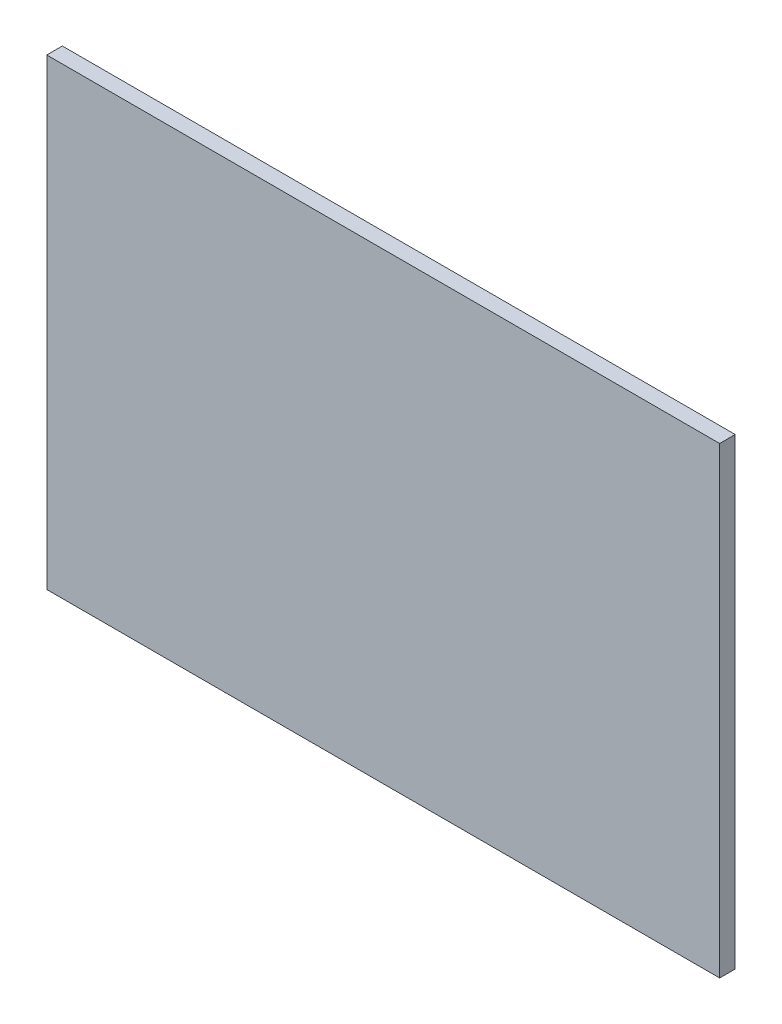
ISO-10303-21;
HEADER;
FILE_DESCRIPTION(('STEP AP214'),'2;1');
FILE_NAME('part.step','',(''),(''),'','','');
FILE_SCHEMA(('AUTOMOTIVE_DESIGN { 1 0 10303 214 1 1 1 1 }'));
ENDSEC;
DATA;
#1=APPLICATION_CONTEXT('core data for automotive mechanical design processes');
#2=APPLICATION_PROTOCOL_DEFINITION('international standard','automotive_design',2000,#1);
#3=PRODUCT_CONTEXT('',#1,'mechanical');
#4=PRODUCT('Part','Part','',(#3));
#5=PRODUCT_RELATED_PRODUCT_CATEGORY('part','',(#4));
#6=PRODUCT_DEFINITION_FORMATION('','',#4);
#7=PRODUCT_DEFINITION_CONTEXT('part definition',#1,'design');
#8=PRODUCT_DEFINITION('design','',#6,#7);
#9=PRODUCT_DEFINITION_SHAPE('','',#8);
#10=(LENGTH_UNIT() NAMED_UNIT(*) SI_UNIT(.MILLI.,.METRE.));
#11=(NAMED_UNIT(*) PLANE_ANGLE_UNIT() SI_UNIT($,.RADIAN.));
#12=(NAMED_UNIT(*) SI_UNIT($,.STERADIAN.) SOLID_ANGLE_UNIT());
#13=UNCERTAINTY_MEASURE_WITH_UNIT(LENGTH_MEASURE(1.E-05),#10,'distance_accuracy_value','');
#14=(GEOMETRIC_REPRESENTATION_CONTEXT(3) GLOBAL_UNCERTAINTY_ASSIGNED_CONTEXT((#13)) GLOBAL_UNIT_ASSIGNED_CONTEXT((#10,
#11,#12)) REPRESENTATION_CONTEXT('',''));
#15=CARTESIAN_POINT('',(0.,0.,0.));
#16=DIRECTION('',(0.,0.,1.));
#17=DIRECTION('',(1.,0.,0.));
#18=AXIS2_PLACEMENT_3D('',#15,#16,#17);
#19=CARTESIAN_POINT('',(2959.92889135267,1214.54135701156,19.05));
#20=DIRECTION('',(0.,1.,0.));
#21=DIRECTION('',(0.,0.,1.));
#22=AXIS2_PLACEMENT_3D('',#19,#20,#21);
#23=PLANE('',#22);
#24=DIRECTION('',(1.,0.,0.));
#25=VECTOR('',#24,1.);
#26=CARTESIAN_POINT('',(2959.92889135267,1214.54135701156,0.));
#27=LINE('',#26,#25);
#28=CARTESIAN_POINT('',(2959.92889135267,1214.54135701156,0.));
#29=VERTEX_POINT('',#28);
#30=CARTESIAN_POINT('',(3783.30037135267,1214.54135701156,0.));
#31=VERTEX_POINT('',#30);
#32=EDGE_CURVE('E96',#29,#31,#27,.T.);
#33=ORIENTED_EDGE('',*,*,#32,.T.);
#34=DIRECTION('',(0.,0.,-1.));
#35=VECTOR('',#34,1.);
#36=CARTESIAN_POINT('',(3783.30037135267,1214.54135701156,19.05));
#37=LINE('',#36,#35);
#38=CARTESIAN_POINT('',(3783.30037135267,1214.54135701156,19.05));
#39=VERTEX_POINT('',#38);
#40=EDGE_CURVE('E11',#39,#31,#37,.T.);
#41=ORIENTED_EDGE('',*,*,#40,.F.);
#42=DIRECTION('',(1.,0.,0.));
#43=VECTOR('',#42,1.);
#44=CARTESIAN_POINT('',(2959.92889135267,1214.54135701156,19.05));
#45=LINE('',#44,#43);
#46=CARTESIAN_POINT('',(2959.92889135267,1214.54135701156,19.05));
#47=VERTEX_POINT('',#46);
#48=EDGE_CURVE('E84',#47,#39,#45,.T.);
#49=ORIENTED_EDGE('',*,*,#48,.F.);
#50=DIRECTION('',(0.,0.,-1.));
#51=VECTOR('',#50,1.);
#52=CARTESIAN_POINT('',(2959.92889135267,1214.54135701156,19.05));
#53=LINE('',#52,#51);
#54=EDGE_CURVE('E92',#47,#29,#53,.T.);
#55=ORIENTED_EDGE('',*,*,#54,.T.);
#56=EDGE_LOOP('',(#33,#41,#49,#55));
#57=FACE_BOUND('',#56,.T.);
#58=ADVANCED_FACE('F33',(#57),#23,.F.);
#59=CARTESIAN_POINT('',(3783.30037135267,1214.54135701156,19.05));
#60=DIRECTION('',(-1.,0.,0.));
#61=DIRECTION('',(0.,0.,1.));
#62=AXIS2_PLACEMENT_3D('',#59,#60,#61);
#63=PLANE('',#62);
#64=DIRECTION('',(0.,1.,0.));
#65=VECTOR('',#64,1.);
#66=CARTESIAN_POINT('',(3783.30037135267,1214.54135701156,0.));
#67=LINE('',#66,#65);
#68=CARTESIAN_POINT('',(3783.30037135267,1780.96135701156,0.));
#69=VERTEX_POINT('',#68);
#70=EDGE_CURVE('E88',#31,#69,#67,.T.);
#71=ORIENTED_EDGE('',*,*,#70,.T.);
#72=DIRECTION('',(0.,0.,-1.));
#73=VECTOR('',#72,1.);
#74=CARTESIAN_POINT('',(3783.30037135267,1780.96135701156,19.05));
#75=LINE('',#74,#73);
#76=CARTESIAN_POINT('',(3783.30037135267,1780.96135701156,19.05));
#77=VERTEX_POINT('',#76);
#78=EDGE_CURVE('E41',#77,#69,#75,.T.);
#79=ORIENTED_EDGE('',*,*,#78,.F.);
#80=DIRECTION('',(0.,1.,0.));
#81=VECTOR('',#80,1.);
#82=CARTESIAN_POINT('',(3783.30037135267,1214.54135701156,19.05));
#83=LINE('',#82,#81);
#84=EDGE_CURVE('E79',#39,#77,#83,.T.);
#85=ORIENTED_EDGE('',*,*,#84,.F.);
#86=ORIENTED_EDGE('',*,*,#40,.T.);
#87=EDGE_LOOP('',(#71,#79,#85,#86));
#88=FACE_BOUND('',#87,.T.);
#89=ADVANCED_FACE('F87',(#88),#63,.F.);
#90=CARTESIAN_POINT('',(3783.30037135267,1780.96135701156,19.05));
#91=DIRECTION('',(0.,-1.,0.));
#92=DIRECTION('',(0.,0.,-1.));
#93=AXIS2_PLACEMENT_3D('',#90,#91,#92);
#94=PLANE('',#93);
#95=DIRECTION('',(-1.,0.,0.));
#96=VECTOR('',#95,1.);
#97=CARTESIAN_POINT('',(3783.30037135267,1780.96135701156,0.));
#98=LINE('',#97,#96);
#99=CARTESIAN_POINT('',(2959.92889135267,1780.96135701156,0.));
#100=VERTEX_POINT('',#99);
#101=EDGE_CURVE('E66',#69,#100,#98,.T.);
#102=ORIENTED_EDGE('',*,*,#101,.T.);
#103=DIRECTION('',(0.,0.,-1.));
#104=VECTOR('',#103,1.);
#105=CARTESIAN_POINT('',(2959.92889135267,1780.96135701156,19.05));
#106=LINE('',#105,#104);
#107=CARTESIAN_POINT('',(2959.92889135267,1780.96135701156,19.05));
#108=VERTEX_POINT('',#107);
#109=EDGE_CURVE('E89',#108,#100,#106,.T.);
#110=ORIENTED_EDGE('',*,*,#109,.F.);
#111=DIRECTION('',(-1.,0.,0.));
#112=VECTOR('',#111,1.);
#113=CARTESIAN_POINT('',(3783.30037135267,1780.96135701156,19.05));
#114=LINE('',#113,#112);
#115=EDGE_CURVE('E82',#77,#108,#114,.T.);
#116=ORIENTED_EDGE('',*,*,#115,.F.);
#117=ORIENTED_EDGE('',*,*,#78,.T.);
#118=EDGE_LOOP('',(#102,#110,#116,#117));
#119=FACE_BOUND('',#118,.T.);
#120=ADVANCED_FACE('F90',(#119),#94,.F.);
#121=CARTESIAN_POINT('',(2959.92889135267,1780.96135701156,19.05));
#122=DIRECTION('',(1.,0.,0.));
#123=DIRECTION('',(0.,0.,-1.));
#124=AXIS2_PLACEMENT_3D('',#121,#122,#123);
#125=PLANE('',#124);
#126=DIRECTION('',(0.,-1.,0.));
#127=VECTOR('',#126,1.);
#128=CARTESIAN_POINT('',(2959.92889135267,1780.96135701156,0.));
#129=LINE('',#128,#127);
#130=EDGE_CURVE('E72',#100,#29,#129,.T.);
#131=ORIENTED_EDGE('',*,*,#130,.T.);
#132=ORIENTED_EDGE('',*,*,#54,.F.);
#133=DIRECTION('',(0.,-1.,0.));
#134=VECTOR('',#133,1.);
#135=CARTESIAN_POINT('',(2959.92889135267,1780.96135701156,19.05));
#136=LINE('',#135,#134);
#137=EDGE_CURVE('E49',#108,#47,#136,.T.);
#138=ORIENTED_EDGE('',*,*,#137,.F.);
#139=ORIENTED_EDGE('',*,*,#109,.T.);
#140=EDGE_LOOP('',(#131,#132,#138,#139));
#141=FACE_BOUND('',#140,.T.);
#142=ADVANCED_FACE('F103',(#141),#125,.F.);
#143=CARTESIAN_POINT('',(0.,0.,19.05));
#144=DIRECTION('',(0.,0.,1.));
#145=DIRECTION('',(1.,0.,0.));
#146=AXIS2_PLACEMENT_3D('',#143,#144,#145);
#147=PLANE('',#146);
#148=ORIENTED_EDGE('',*,*,#48,.T.);
#149=ORIENTED_EDGE('',*,*,#84,.T.);
#150=ORIENTED_EDGE('',*,*,#115,.T.);
#151=ORIENTED_EDGE('',*,*,#137,.T.);
#152=EDGE_LOOP('',(#148,#149,#150,#151));
#153=FACE_BOUND('',#152,.T.);
#154=ADVANCED_FACE('F80',(#153),#147,.T.);
#155=CARTESIAN_POINT('',(0.,0.,0.));
#156=DIRECTION('',(0.,0.,1.));
#157=DIRECTION('',(1.,0.,0.));
#158=AXIS2_PLACEMENT_3D('',#155,#156,#157);
#159=PLANE('',#158);
#160=ORIENTED_EDGE('',*,*,#32,.F.);
#161=ORIENTED_EDGE('',*,*,#130,.F.);
#162=ORIENTED_EDGE('',*,*,#101,.F.);
#163=ORIENTED_EDGE('',*,*,#70,.F.);
#164=EDGE_LOOP('',(#160,#161,#162,#163));
#165=FACE_BOUND('',#164,.T.);
#166=ADVANCED_FACE('F106',(#165),#159,.F.);
#167=CLOSED_SHELL('',(#58,#89,#120,#142,#154,#166));
#168=MANIFOLD_SOLID_BREP('B2',#167);
#169=ADVANCED_BREP_SHAPE_REPRESENTATION('',(#18,#168),#14);
#170=SHAPE_DEFINITION_REPRESENTATION(#9,#169);
ENDSEC;
END-ISO-10303-21;
